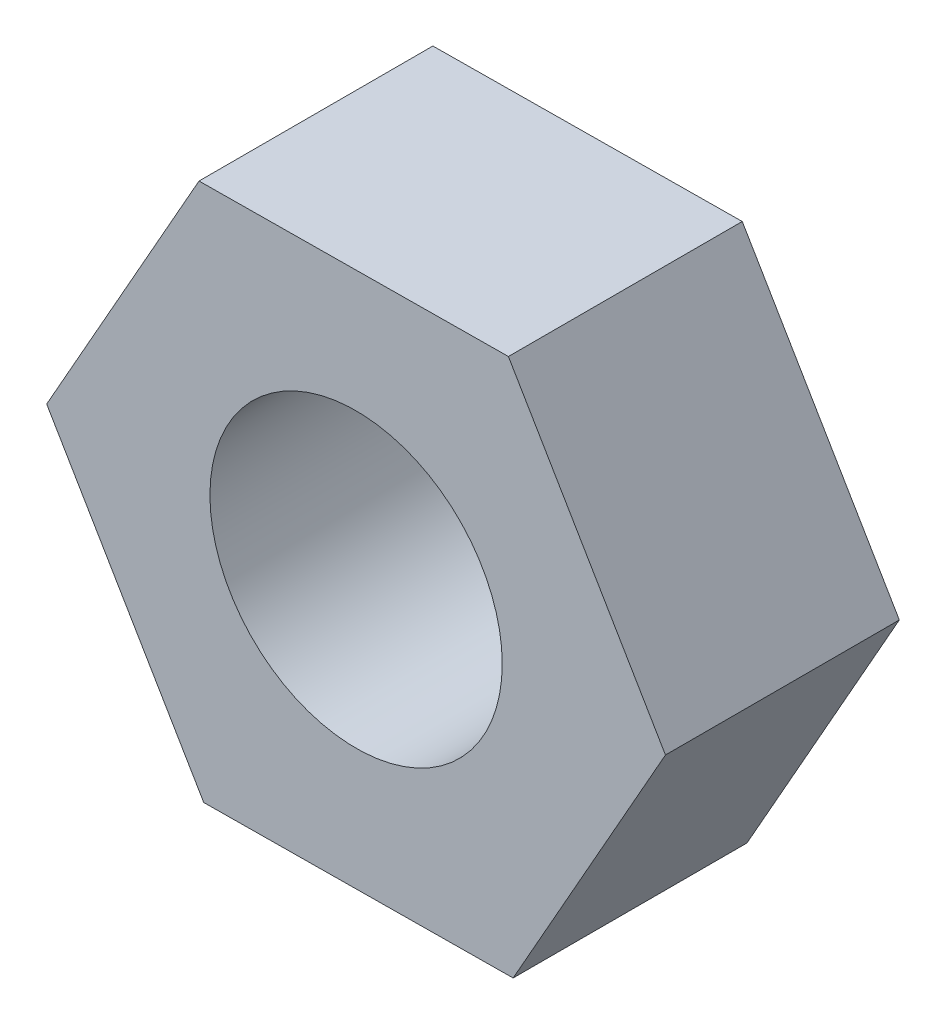
ISO-10303-21;
HEADER;
FILE_DESCRIPTION(('STEP AP214'),'2;1');
FILE_NAME('part.step','',(''),(''),'','','');
FILE_SCHEMA(('AUTOMOTIVE_DESIGN { 1 0 10303 214 1 1 1 1 }'));
ENDSEC;
DATA;
#1=APPLICATION_CONTEXT('core data for automotive mechanical design processes');
#2=APPLICATION_PROTOCOL_DEFINITION('international standard','automotive_design',2000,#1);
#3=PRODUCT_CONTEXT('',#1,'mechanical');
#4=PRODUCT('Part','Part','',(#3));
#5=PRODUCT_RELATED_PRODUCT_CATEGORY('part','',(#4));
#6=PRODUCT_DEFINITION_FORMATION('','',#4);
#7=PRODUCT_DEFINITION_CONTEXT('part definition',#1,'design');
#8=PRODUCT_DEFINITION('design','',#6,#7);
#9=PRODUCT_DEFINITION_SHAPE('','',#8);
#10=(LENGTH_UNIT() NAMED_UNIT(*) SI_UNIT(.MILLI.,.METRE.));
#11=(NAMED_UNIT(*) PLANE_ANGLE_UNIT() SI_UNIT($,.RADIAN.));
#12=(NAMED_UNIT(*) SI_UNIT($,.STERADIAN.) SOLID_ANGLE_UNIT());
#13=UNCERTAINTY_MEASURE_WITH_UNIT(LENGTH_MEASURE(1.E-05),#10,'distance_accuracy_value','');
#14=(GEOMETRIC_REPRESENTATION_CONTEXT(3) GLOBAL_UNCERTAINTY_ASSIGNED_CONTEXT((#13)) GLOBAL_UNIT_ASSIGNED_CONTEXT((#10,
#11,#12)) REPRESENTATION_CONTEXT('',''));
#15=CARTESIAN_POINT('',(0.,0.,0.));
#16=DIRECTION('',(0.,0.,1.));
#17=DIRECTION('',(1.,0.,0.));
#18=AXIS2_PLACEMENT_3D('',#15,#16,#17);
#19=CARTESIAN_POINT('',(0.,0.,2.4));
#20=DIRECTION('',(0.,0.,1.));
#21=DIRECTION('',(1.,0.,0.));
#22=AXIS2_PLACEMENT_3D('',#19,#20,#21);
#23=PLANE('',#22);
#24=DIRECTION('',(0.999961257640527,0.00880245522430783,0.));
#25=VECTOR('',#24,1.);
#26=CARTESIAN_POINT('',(-1.56344497664753,-2.76386923321798,2.4));
#27=LINE('',#26,#25);
#28=CARTESIAN_POINT('',(-1.56344497664753,-2.76386923321798,2.4));
#29=VERTEX_POINT('',#28);
#30=CARTESIAN_POINT('',(1.61185848038122,-2.73591768380492,2.4));
#31=VERTEX_POINT('',#30);
#32=EDGE_CURVE('E132',#29,#31,#27,.T.);
#33=ORIENTED_EDGE('',*,*,#32,.T.);
#34=DIRECTION('',(0.492357478980338,0.870393079529086,0.));
#35=VECTOR('',#34,1.);
#36=CARTESIAN_POINT('',(1.61185848038122,-2.73591768380492,2.4));
#37=LINE('',#36,#35);
#38=CARTESIAN_POINT('',(3.17530345702875,0.0279515494130611,2.4));
#39=VERTEX_POINT('',#38);
#40=EDGE_CURVE('E90',#31,#39,#37,.T.);
#41=ORIENTED_EDGE('',*,*,#40,.T.);
#42=DIRECTION('',(-0.507603778660189,0.861590624304778,0.));
#43=VECTOR('',#42,1.);
#44=CARTESIAN_POINT('',(3.17530345702875,0.0279515494130611,2.4));
#45=LINE('',#44,#43);
#46=CARTESIAN_POINT('',(1.56344497664753,2.76386923321798,2.4));
#47=VERTEX_POINT('',#46);
#48=EDGE_CURVE('E103',#39,#47,#45,.T.);
#49=ORIENTED_EDGE('',*,*,#48,.T.);
#50=DIRECTION('',(-0.999961257640527,-0.00880245522430783,0.));
#51=VECTOR('',#50,1.);
#52=CARTESIAN_POINT('',(1.56344497664753,2.76386923321798,2.4));
#53=LINE('',#52,#51);
#54=CARTESIAN_POINT('',(-1.61185848038122,2.73591768380492,2.4));
#55=VERTEX_POINT('',#54);
#56=EDGE_CURVE('E97',#47,#55,#53,.T.);
#57=ORIENTED_EDGE('',*,*,#56,.T.);
#58=DIRECTION('',(-0.492357478980338,-0.870393079529086,0.));
#59=VECTOR('',#58,1.);
#60=CARTESIAN_POINT('',(-1.61185848038122,2.73591768380492,2.4));
#61=LINE('',#60,#59);
#62=CARTESIAN_POINT('',(-3.17530345702875,-0.02795154941306,2.4));
#63=VERTEX_POINT('',#62);
#64=EDGE_CURVE('E101',#55,#63,#61,.T.);
#65=ORIENTED_EDGE('',*,*,#64,.T.);
#66=DIRECTION('',(0.507603778660189,-0.861590624304779,0.));
#67=VECTOR('',#66,1.);
#68=CARTESIAN_POINT('',(-3.17530345702875,-0.02795154941306,2.4));
#69=LINE('',#68,#67);
#70=EDGE_CURVE('E53',#63,#29,#69,.T.);
#71=ORIENTED_EDGE('',*,*,#70,.T.);
#72=EDGE_LOOP('',(#33,#41,#49,#57,#65,#71));
#73=FACE_BOUND('',#72,.T.);
#74=CARTESIAN_POINT('',(0.,0.,2.4));
#75=DIRECTION('',(0.,0.,1.));
#76=DIRECTION('',(1.,0.,0.));
#77=AXIS2_PLACEMENT_3D('',#74,#75,#76);
#78=CIRCLE('',#77,1.5);
#79=CARTESIAN_POINT('',(1.5,0.,2.4));
#80=VERTEX_POINT('',#79);
#81=EDGE_CURVE('E125',#80,#80,#78,.T.);
#82=ORIENTED_EDGE('',*,*,#81,.F.);
#83=EDGE_LOOP('',(#82));
#84=FACE_BOUND('',#83,.T.);
#85=ADVANCED_FACE('F36',(#73,#84),#23,.T.);
#86=CARTESIAN_POINT('',(0.,0.,0.));
#87=DIRECTION('',(0.,0.,1.));
#88=DIRECTION('',(1.,0.,0.));
#89=AXIS2_PLACEMENT_3D('',#86,#87,#88);
#90=PLANE('',#89);
#91=DIRECTION('',(0.999961257640527,0.00880245522430783,0.));
#92=VECTOR('',#91,1.);
#93=CARTESIAN_POINT('',(-1.56344497664753,-2.76386923321798,0.));
#94=LINE('',#93,#92);
#95=CARTESIAN_POINT('',(-1.56344497664753,-2.76386923321798,0.));
#96=VERTEX_POINT('',#95);
#97=CARTESIAN_POINT('',(1.61185848038122,-2.73591768380492,0.));
#98=VERTEX_POINT('',#97);
#99=EDGE_CURVE('E121',#96,#98,#94,.T.);
#100=ORIENTED_EDGE('',*,*,#99,.F.);
#101=DIRECTION('',(0.507603778660189,-0.861590624304779,0.));
#102=VECTOR('',#101,1.);
#103=CARTESIAN_POINT('',(-3.17530345702875,-0.02795154941306,0.));
#104=LINE('',#103,#102);
#105=CARTESIAN_POINT('',(-3.17530345702875,-0.02795154941306,0.));
#106=VERTEX_POINT('',#105);
#107=EDGE_CURVE('E82',#106,#96,#104,.T.);
#108=ORIENTED_EDGE('',*,*,#107,.F.);
#109=DIRECTION('',(-0.492357478980338,-0.870393079529086,0.));
#110=VECTOR('',#109,1.);
#111=CARTESIAN_POINT('',(-1.61185848038122,2.73591768380492,0.));
#112=LINE('',#111,#110);
#113=CARTESIAN_POINT('',(-1.61185848038122,2.73591768380492,0.));
#114=VERTEX_POINT('',#113);
#115=EDGE_CURVE('E76',#114,#106,#112,.T.);
#116=ORIENTED_EDGE('',*,*,#115,.F.);
#117=DIRECTION('',(-0.999961257640527,-0.00880245522430783,0.));
#118=VECTOR('',#117,1.);
#119=CARTESIAN_POINT('',(1.56344497664753,2.76386923321798,0.));
#120=LINE('',#119,#118);
#121=CARTESIAN_POINT('',(1.56344497664753,2.76386923321798,0.));
#122=VERTEX_POINT('',#121);
#123=EDGE_CURVE('E111',#122,#114,#120,.T.);
#124=ORIENTED_EDGE('',*,*,#123,.F.);
#125=DIRECTION('',(-0.507603778660189,0.861590624304778,0.));
#126=VECTOR('',#125,1.);
#127=CARTESIAN_POINT('',(3.17530345702875,0.0279515494130611,0.));
#128=LINE('',#127,#126);
#129=CARTESIAN_POINT('',(3.17530345702875,0.0279515494130611,0.));
#130=VERTEX_POINT('',#129);
#131=EDGE_CURVE('E127',#130,#122,#128,.T.);
#132=ORIENTED_EDGE('',*,*,#131,.F.);
#133=DIRECTION('',(0.492357478980338,0.870393079529086,0.));
#134=VECTOR('',#133,1.);
#135=CARTESIAN_POINT('',(1.61185848038122,-2.73591768380492,0.));
#136=LINE('',#135,#134);
#137=EDGE_CURVE('E124',#98,#130,#136,.T.);
#138=ORIENTED_EDGE('',*,*,#137,.F.);
#139=EDGE_LOOP('',(#100,#108,#116,#124,#132,#138));
#140=FACE_BOUND('',#139,.T.);
#141=CARTESIAN_POINT('',(0.,0.,0.));
#142=DIRECTION('',(0.,0.,1.));
#143=DIRECTION('',(1.,0.,0.));
#144=AXIS2_PLACEMENT_3D('',#141,#142,#143);
#145=CIRCLE('',#144,1.5);
#146=CARTESIAN_POINT('',(1.5,0.,0.));
#147=VERTEX_POINT('',#146);
#148=EDGE_CURVE('E225',#147,#147,#145,.T.);
#149=ORIENTED_EDGE('',*,*,#148,.T.);
#150=EDGE_LOOP('',(#149));
#151=FACE_BOUND('',#150,.T.);
#152=ADVANCED_FACE('F141',(#140,#151),#90,.F.);
#153=CARTESIAN_POINT('',(-1.56344497664753,-2.76386923321798,2.4));
#154=DIRECTION('',(-0.00880245522430783,0.999961257640527,0.));
#155=DIRECTION('',(-0.999961257640527,-0.00880245522430783,0.));
#156=AXIS2_PLACEMENT_3D('',#153,#154,#155);
#157=PLANE('',#156);
#158=ORIENTED_EDGE('',*,*,#99,.T.);
#159=DIRECTION('',(0.,0.,-1.));
#160=VECTOR('',#159,1.);
#161=CARTESIAN_POINT('',(1.61185848038122,-2.73591768380492,2.4));
#162=LINE('',#161,#160);
#163=EDGE_CURVE('E11',#31,#98,#162,.T.);
#164=ORIENTED_EDGE('',*,*,#163,.F.);
#165=ORIENTED_EDGE('',*,*,#32,.F.);
#166=DIRECTION('',(0.,0.,-1.));
#167=VECTOR('',#166,1.);
#168=CARTESIAN_POINT('',(-1.56344497664753,-2.76386923321798,2.4));
#169=LINE('',#168,#167);
#170=EDGE_CURVE('E117',#29,#96,#169,.T.);
#171=ORIENTED_EDGE('',*,*,#170,.T.);
#172=EDGE_LOOP('',(#158,#164,#165,#171));
#173=FACE_BOUND('',#172,.T.);
#174=ADVANCED_FACE('F38',(#173),#157,.F.);
#175=CARTESIAN_POINT('',(1.61185848038122,-2.73591768380492,2.4));
#176=DIRECTION('',(-0.870393079529086,0.492357478980338,0.));
#177=DIRECTION('',(-0.492357478980338,-0.870393079529086,0.));
#178=AXIS2_PLACEMENT_3D('',#175,#176,#177);
#179=PLANE('',#178);
#180=ORIENTED_EDGE('',*,*,#137,.T.);
#181=DIRECTION('',(0.,0.,-1.));
#182=VECTOR('',#181,1.);
#183=CARTESIAN_POINT('',(3.17530345702875,0.0279515494130611,2.4));
#184=LINE('',#183,#182);
#185=EDGE_CURVE('E45',#39,#130,#184,.T.);
#186=ORIENTED_EDGE('',*,*,#185,.F.);
#187=ORIENTED_EDGE('',*,*,#40,.F.);
#188=ORIENTED_EDGE('',*,*,#163,.T.);
#189=EDGE_LOOP('',(#180,#186,#187,#188));
#190=FACE_BOUND('',#189,.T.);
#191=ADVANCED_FACE('F166',(#190),#179,.F.);
#192=CARTESIAN_POINT('',(3.17530345702875,0.0279515494130611,2.4));
#193=DIRECTION('',(-0.861590624304779,-0.507603778660189,0.));
#194=DIRECTION('',(0.507603778660189,-0.861590624304779,0.));
#195=AXIS2_PLACEMENT_3D('',#192,#193,#194);
#196=PLANE('',#195);
#197=ORIENTED_EDGE('',*,*,#131,.T.);
#198=DIRECTION('',(0.,0.,-1.));
#199=VECTOR('',#198,1.);
#200=CARTESIAN_POINT('',(1.56344497664753,2.76386923321798,2.4));
#201=LINE('',#200,#199);
#202=EDGE_CURVE('E112',#47,#122,#201,.T.);
#203=ORIENTED_EDGE('',*,*,#202,.F.);
#204=ORIENTED_EDGE('',*,*,#48,.F.);
#205=ORIENTED_EDGE('',*,*,#185,.T.);
#206=EDGE_LOOP('',(#197,#203,#204,#205));
#207=FACE_BOUND('',#206,.T.);
#208=ADVANCED_FACE('F138',(#207),#196,.F.);
#209=CARTESIAN_POINT('',(1.56344497664753,2.76386923321798,2.4));
#210=DIRECTION('',(0.00880245522430783,-0.999961257640527,0.));
#211=DIRECTION('',(0.999961257640527,0.00880245522430783,0.));
#212=AXIS2_PLACEMENT_3D('',#209,#210,#211);
#213=PLANE('',#212);
#214=ORIENTED_EDGE('',*,*,#123,.T.);
#215=DIRECTION('',(0.,0.,-1.));
#216=VECTOR('',#215,1.);
#217=CARTESIAN_POINT('',(-1.61185848038122,2.73591768380492,2.4));
#218=LINE('',#217,#216);
#219=EDGE_CURVE('E108',#55,#114,#218,.T.);
#220=ORIENTED_EDGE('',*,*,#219,.F.);
#221=ORIENTED_EDGE('',*,*,#56,.F.);
#222=ORIENTED_EDGE('',*,*,#202,.T.);
#223=EDGE_LOOP('',(#214,#220,#221,#222));
#224=FACE_BOUND('',#223,.T.);
#225=ADVANCED_FACE('F109',(#224),#213,.F.);
#226=CARTESIAN_POINT('',(-1.61185848038122,2.73591768380492,2.4));
#227=DIRECTION('',(0.870393079529086,-0.492357478980338,0.));
#228=DIRECTION('',(0.492357478980338,0.870393079529086,0.));
#229=AXIS2_PLACEMENT_3D('',#226,#227,#228);
#230=PLANE('',#229);
#231=ORIENTED_EDGE('',*,*,#115,.T.);
#232=DIRECTION('',(0.,0.,-1.));
#233=VECTOR('',#232,1.);
#234=CARTESIAN_POINT('',(-3.17530345702875,-0.02795154941306,2.4));
#235=LINE('',#234,#233);
#236=EDGE_CURVE('E113',#63,#106,#235,.T.);
#237=ORIENTED_EDGE('',*,*,#236,.F.);
#238=ORIENTED_EDGE('',*,*,#64,.F.);
#239=ORIENTED_EDGE('',*,*,#219,.T.);
#240=EDGE_LOOP('',(#231,#237,#238,#239));
#241=FACE_BOUND('',#240,.T.);
#242=ADVANCED_FACE('F115',(#241),#230,.F.);
#243=CARTESIAN_POINT('',(-3.17530345702875,-0.02795154941306,2.4));
#244=DIRECTION('',(0.861590624304778,0.507603778660189,0.));
#245=DIRECTION('',(-0.507603778660189,0.861590624304778,0.));
#246=AXIS2_PLACEMENT_3D('',#243,#244,#245);
#247=PLANE('',#246);
#248=ORIENTED_EDGE('',*,*,#107,.T.);
#249=ORIENTED_EDGE('',*,*,#170,.F.);
#250=ORIENTED_EDGE('',*,*,#70,.F.);
#251=ORIENTED_EDGE('',*,*,#236,.T.);
#252=EDGE_LOOP('',(#248,#249,#250,#251));
#253=FACE_BOUND('',#252,.T.);
#254=ADVANCED_FACE('F146',(#253),#247,.F.);
#255=CARTESIAN_POINT('',(0.,0.,2.4));
#256=DIRECTION('',(0.,0.,-1.));
#257=DIRECTION('',(-1.,0.,0.));
#258=AXIS2_PLACEMENT_3D('',#255,#256,#257);
#259=CYLINDRICAL_SURFACE('',#258,1.5);
#260=ORIENTED_EDGE('',*,*,#81,.T.);
#261=EDGE_LOOP('',(#260));
#262=FACE_BOUND('',#261,.T.);
#263=ORIENTED_EDGE('',*,*,#148,.F.);
#264=EDGE_LOOP('',(#263));
#265=FACE_BOUND('',#264,.T.);
#266=ADVANCED_FACE('F148',(#262,#265),#259,.F.);
#267=CLOSED_SHELL('',(#85,#152,#174,#191,#208,#225,#242,#254,#266));
#268=MANIFOLD_SOLID_BREP('B2',#267);
#269=ADVANCED_BREP_SHAPE_REPRESENTATION('',(#18,#268),#14);
#270=SHAPE_DEFINITION_REPRESENTATION(#9,#269);
ENDSEC;
END-ISO-10303-21;
